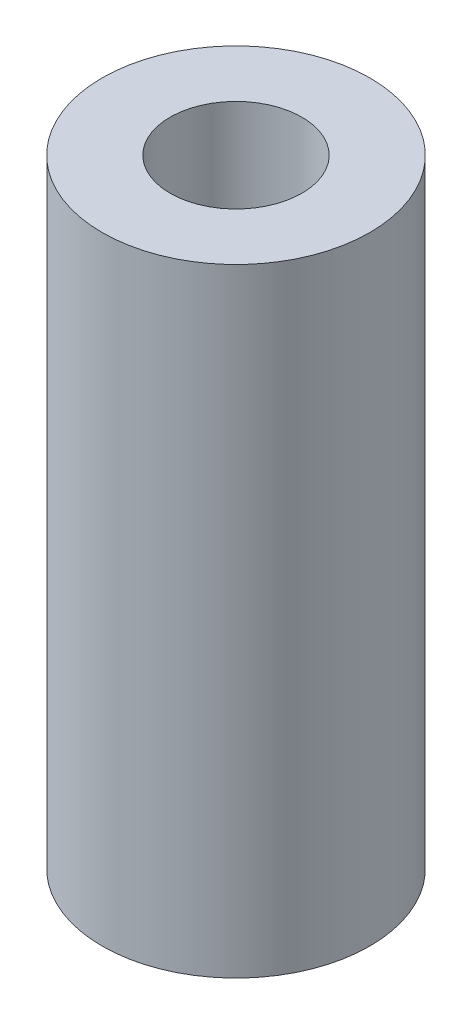
ISO-10303-21;
HEADER;
FILE_DESCRIPTION(('STEP AP214'),'2;1');
FILE_NAME('part.step','',(''),(''),'','','');
FILE_SCHEMA(('AUTOMOTIVE_DESIGN { 1 0 10303 214 1 1 1 1 }'));
ENDSEC;
DATA;
#1=APPLICATION_CONTEXT('core data for automotive mechanical design processes');
#2=APPLICATION_PROTOCOL_DEFINITION('international standard','automotive_design',2000,#1);
#3=PRODUCT_CONTEXT('',#1,'mechanical');
#4=PRODUCT('Part','Part','',(#3));
#5=PRODUCT_RELATED_PRODUCT_CATEGORY('part','',(#4));
#6=PRODUCT_DEFINITION_FORMATION('','',#4);
#7=PRODUCT_DEFINITION_CONTEXT('part definition',#1,'design');
#8=PRODUCT_DEFINITION('design','',#6,#7);
#9=PRODUCT_DEFINITION_SHAPE('','',#8);
#10=(LENGTH_UNIT() NAMED_UNIT(*) SI_UNIT(.MILLI.,.METRE.));
#11=(NAMED_UNIT(*) PLANE_ANGLE_UNIT() SI_UNIT($,.RADIAN.));
#12=(NAMED_UNIT(*) SI_UNIT($,.STERADIAN.) SOLID_ANGLE_UNIT());
#13=UNCERTAINTY_MEASURE_WITH_UNIT(LENGTH_MEASURE(1.E-05),#10,'distance_accuracy_value','');
#14=(GEOMETRIC_REPRESENTATION_CONTEXT(3) GLOBAL_UNCERTAINTY_ASSIGNED_CONTEXT((#13)) GLOBAL_UNIT_ASSIGNED_CONTEXT((#10,
#11,#12)) REPRESENTATION_CONTEXT('',''));
#15=CARTESIAN_POINT('',(0.,0.,0.));
#16=DIRECTION('',(0.,0.,1.));
#17=DIRECTION('',(1.,0.,0.));
#18=AXIS2_PLACEMENT_3D('',#15,#16,#17);
#19=CARTESIAN_POINT('',(0.,15.,0.));
#20=DIRECTION('',(0.,1.,0.));
#21=DIRECTION('',(0.,0.,1.));
#22=AXIS2_PLACEMENT_3D('',#19,#20,#21);
#23=PLANE('',#22);
#24=CARTESIAN_POINT('',(0.,15.,0.));
#25=DIRECTION('',(0.,1.,0.));
#26=DIRECTION('',(0.,0.,1.));
#27=AXIS2_PLACEMENT_3D('',#24,#25,#26);
#28=CIRCLE('',#27,3.25);
#29=CARTESIAN_POINT('',(0.,15.,3.25));
#30=VERTEX_POINT('',#29);
#31=EDGE_CURVE('E10',#30,#30,#28,.T.);
#32=ORIENTED_EDGE('',*,*,#31,.T.);
#33=EDGE_LOOP('',(#32));
#34=FACE_BOUND('',#33,.T.);
#35=CARTESIAN_POINT('',(0.,15.,0.));
#36=DIRECTION('',(0.,1.,0.));
#37=DIRECTION('',(0.,0.,1.));
#38=AXIS2_PLACEMENT_3D('',#35,#36,#37);
#39=CIRCLE('',#38,1.6);
#40=CARTESIAN_POINT('',(0.,15.,1.6));
#41=VERTEX_POINT('',#40);
#42=EDGE_CURVE('E42',#41,#41,#39,.T.);
#43=ORIENTED_EDGE('',*,*,#42,.F.);
#44=EDGE_LOOP('',(#43));
#45=FACE_BOUND('',#44,.T.);
#46=ADVANCED_FACE('F31',(#34,#45),#23,.T.);
#47=CARTESIAN_POINT('',(0.,0.,0.));
#48=DIRECTION('',(0.,1.,0.));
#49=DIRECTION('',(0.,0.,1.));
#50=AXIS2_PLACEMENT_3D('',#47,#48,#49);
#51=PLANE('',#50);
#52=CARTESIAN_POINT('',(0.,0.,0.));
#53=DIRECTION('',(0.,1.,0.));
#54=DIRECTION('',(0.,0.,1.));
#55=AXIS2_PLACEMENT_3D('',#52,#53,#54);
#56=CIRCLE('',#55,3.25);
#57=CARTESIAN_POINT('',(0.,0.,3.25));
#58=VERTEX_POINT('',#57);
#59=EDGE_CURVE('E35',#58,#58,#56,.T.);
#60=ORIENTED_EDGE('',*,*,#59,.F.);
#61=EDGE_LOOP('',(#60));
#62=FACE_BOUND('',#61,.T.);
#63=CARTESIAN_POINT('',(0.,0.,0.));
#64=DIRECTION('',(0.,1.,0.));
#65=DIRECTION('',(0.,0.,1.));
#66=AXIS2_PLACEMENT_3D('',#63,#64,#65);
#67=CIRCLE('',#66,1.6);
#68=CARTESIAN_POINT('',(0.,0.,1.6));
#69=VERTEX_POINT('',#68);
#70=EDGE_CURVE('E44',#69,#69,#67,.T.);
#71=ORIENTED_EDGE('',*,*,#70,.T.);
#72=EDGE_LOOP('',(#71));
#73=FACE_BOUND('',#72,.T.);
#74=ADVANCED_FACE('F54',(#62,#73),#51,.F.);
#75=CARTESIAN_POINT('',(0.,15.,0.));
#76=DIRECTION('',(0.,-1.,0.));
#77=DIRECTION('',(0.,0.,-1.));
#78=AXIS2_PLACEMENT_3D('',#75,#76,#77);
#79=CYLINDRICAL_SURFACE('',#78,3.25);
#80=ORIENTED_EDGE('',*,*,#31,.F.);
#81=EDGE_LOOP('',(#80));
#82=FACE_BOUND('',#81,.T.);
#83=ORIENTED_EDGE('',*,*,#59,.T.);
#84=EDGE_LOOP('',(#83));
#85=FACE_BOUND('',#84,.T.);
#86=ADVANCED_FACE('F33',(#82,#85),#79,.T.);
#87=CARTESIAN_POINT('',(0.,15.,0.));
#88=DIRECTION('',(0.,-1.,0.));
#89=DIRECTION('',(0.,0.,-1.));
#90=AXIS2_PLACEMENT_3D('',#87,#88,#89);
#91=CYLINDRICAL_SURFACE('',#90,1.6);
#92=ORIENTED_EDGE('',*,*,#42,.T.);
#93=EDGE_LOOP('',(#92));
#94=FACE_BOUND('',#93,.T.);
#95=ORIENTED_EDGE('',*,*,#70,.F.);
#96=EDGE_LOOP('',(#95));
#97=FACE_BOUND('',#96,.T.);
#98=ADVANCED_FACE('F50',(#94,#97),#91,.F.);
#99=CLOSED_SHELL('',(#46,#74,#86,#98));
#100=MANIFOLD_SOLID_BREP('B2',#99);
#101=ADVANCED_BREP_SHAPE_REPRESENTATION('',(#18,#100),#14);
#102=SHAPE_DEFINITION_REPRESENTATION(#9,#101);
ENDSEC;
END-ISO-10303-21;
